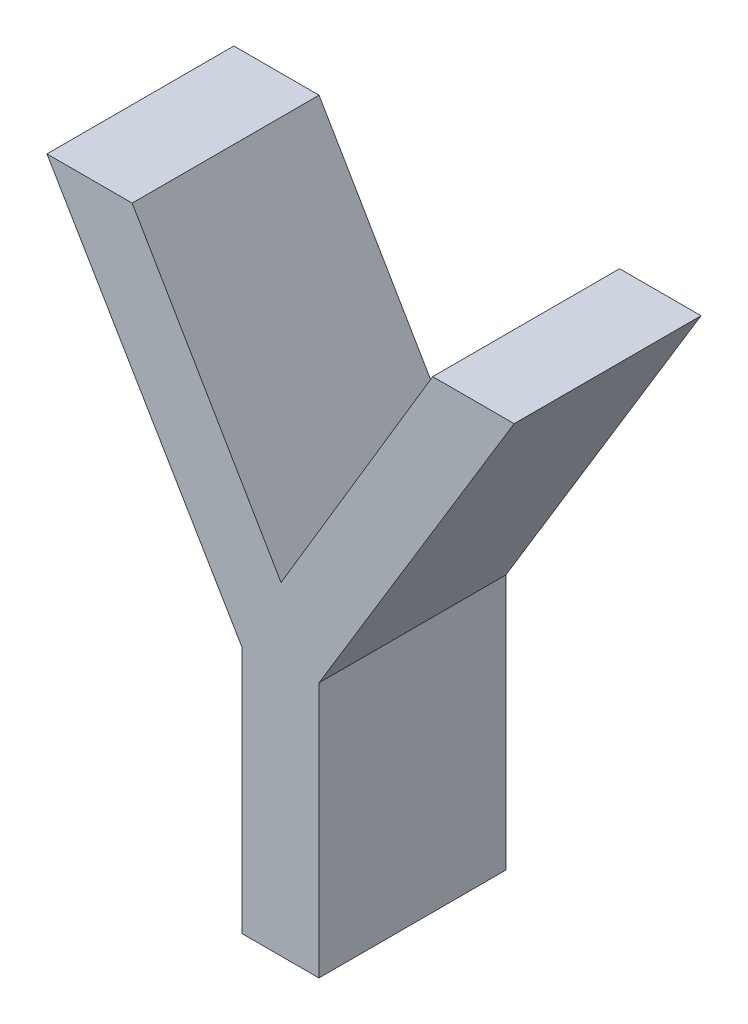
ISO-10303-21;
HEADER;
FILE_DESCRIPTION(('STEP AP214'),'2;1');
FILE_NAME('part.step','',(''),(''),'','','');
FILE_SCHEMA(('AUTOMOTIVE_DESIGN { 1 0 10303 214 1 1 1 1 }'));
ENDSEC;
DATA;
#1=APPLICATION_CONTEXT('core data for automotive mechanical design processes');
#2=APPLICATION_PROTOCOL_DEFINITION('international standard','automotive_design',2000,#1);
#3=PRODUCT_CONTEXT('',#1,'mechanical');
#4=PRODUCT('Part','Part','',(#3));
#5=PRODUCT_RELATED_PRODUCT_CATEGORY('part','',(#4));
#6=PRODUCT_DEFINITION_FORMATION('','',#4);
#7=PRODUCT_DEFINITION_CONTEXT('part definition',#1,'design');
#8=PRODUCT_DEFINITION('design','',#6,#7);
#9=PRODUCT_DEFINITION_SHAPE('','',#8);
#10=(LENGTH_UNIT() NAMED_UNIT(*) SI_UNIT(.MILLI.,.METRE.));
#11=(NAMED_UNIT(*) PLANE_ANGLE_UNIT() SI_UNIT($,.RADIAN.));
#12=(NAMED_UNIT(*) SI_UNIT($,.STERADIAN.) SOLID_ANGLE_UNIT());
#13=UNCERTAINTY_MEASURE_WITH_UNIT(LENGTH_MEASURE(1.E-05),#10,'distance_accuracy_value','');
#14=(GEOMETRIC_REPRESENTATION_CONTEXT(3) GLOBAL_UNCERTAINTY_ASSIGNED_CONTEXT((#13)) GLOBAL_UNIT_ASSIGNED_CONTEXT((#10,
#11,#12)) REPRESENTATION_CONTEXT('',''));
#15=CARTESIAN_POINT('',(0.,0.,0.));
#16=DIRECTION('',(0.,0.,1.));
#17=DIRECTION('',(1.,0.,0.));
#18=AXIS2_PLACEMENT_3D('',#15,#16,#17);
#19=CARTESIAN_POINT('',(0.0464557612857669,-2.941706644287,0.));
#20=DIRECTION('',(1.,0.,0.));
#21=DIRECTION('',(0.,1.,0.));
#22=AXIS2_PLACEMENT_3D('',#19,#20,#21);
#23=PLANE('',#22);
#24=DIRECTION('',(0.,-1.,0.));
#25=VECTOR('',#24,1.);
#26=CARTESIAN_POINT('',(0.0464557612857669,-2.804939731235,0.));
#27=LINE('',#26,#25);
#28=CARTESIAN_POINT('',(0.0464557612857669,-2.804939731235,0.));
#29=VERTEX_POINT('',#28);
#30=CARTESIAN_POINT('',(0.0464557612857669,-2.941706644287,0.));
#31=VERTEX_POINT('',#30);
#32=EDGE_CURVE('E11',#29,#31,#27,.T.);
#33=ORIENTED_EDGE('',*,*,#32,.F.);
#34=DIRECTION('',(0.,0.,1.));
#35=VECTOR('',#34,1.);
#36=CARTESIAN_POINT('',(0.0464557612857669,-2.804939731235,0.));
#37=LINE('',#36,#35);
#38=CARTESIAN_POINT('',(0.0464557612857669,-2.804939731235,0.1));
#39=VERTEX_POINT('',#38);
#40=EDGE_CURVE('E24',#29,#39,#37,.T.);
#41=ORIENTED_EDGE('',*,*,#40,.T.);
#42=DIRECTION('',(0.,1.,0.));
#43=VECTOR('',#42,1.);
#44=CARTESIAN_POINT('',(0.0464557612857669,-2.804939731235,0.1));
#45=LINE('',#44,#43);
#46=CARTESIAN_POINT('',(0.0464557612857669,-2.941706644287,0.1));
#47=VERTEX_POINT('',#46);
#48=EDGE_CURVE('E106',#47,#39,#45,.T.);
#49=ORIENTED_EDGE('',*,*,#48,.F.);
#50=DIRECTION('',(0.,0.,1.));
#51=VECTOR('',#50,1.);
#52=CARTESIAN_POINT('',(0.0464557612857669,-2.941706644287,0.));
#53=LINE('',#52,#51);
#54=EDGE_CURVE('E155',#31,#47,#53,.T.);
#55=ORIENTED_EDGE('',*,*,#54,.F.);
#56=EDGE_LOOP('',(#33,#41,#49,#55));
#57=FACE_BOUND('',#56,.T.);
#58=ADVANCED_FACE('F17',(#57),#23,.T.);
#59=CARTESIAN_POINT('',(0.00537558959963614,-2.941706644287,0.));
#60=DIRECTION('',(0.,-1.,0.));
#61=DIRECTION('',(1.,0.,0.));
#62=AXIS2_PLACEMENT_3D('',#59,#60,#61);
#63=PLANE('',#62);
#64=DIRECTION('',(-1.,0.,0.));
#65=VECTOR('',#64,1.);
#66=CARTESIAN_POINT('',(0.0464557612857669,-2.941706644287,0.));
#67=LINE('',#66,#65);
#68=CARTESIAN_POINT('',(0.00537558959963614,-2.941706644287,0.));
#69=VERTEX_POINT('',#68);
#70=EDGE_CURVE('E153',#31,#69,#67,.T.);
#71=ORIENTED_EDGE('',*,*,#70,.F.);
#72=ORIENTED_EDGE('',*,*,#54,.T.);
#73=DIRECTION('',(1.,0.,0.));
#74=VECTOR('',#73,1.);
#75=CARTESIAN_POINT('',(0.0464557612857669,-2.941706644287,0.1));
#76=LINE('',#75,#74);
#77=CARTESIAN_POINT('',(0.00537558959963614,-2.941706644287,0.1));
#78=VERTEX_POINT('',#77);
#79=EDGE_CURVE('E151',#78,#47,#76,.T.);
#80=ORIENTED_EDGE('',*,*,#79,.F.);
#81=DIRECTION('',(0.,0.,1.));
#82=VECTOR('',#81,1.);
#83=CARTESIAN_POINT('',(0.00537558959963614,-2.941706644287,0.));
#84=LINE('',#83,#82);
#85=EDGE_CURVE('E148',#69,#78,#84,.T.);
#86=ORIENTED_EDGE('',*,*,#85,.F.);
#87=EDGE_LOOP('',(#71,#72,#80,#86));
#88=FACE_BOUND('',#87,.T.);
#89=ADVANCED_FACE('F181',(#88),#63,.T.);
#90=CARTESIAN_POINT('',(0.00537558959963614,-2.809198041714,0.));
#91=DIRECTION('',(-1.,0.,0.));
#92=DIRECTION('',(0.,-1.,0.));
#93=AXIS2_PLACEMENT_3D('',#90,#91,#92);
#94=PLANE('',#93);
#95=DIRECTION('',(0.,1.,0.));
#96=VECTOR('',#95,1.);
#97=CARTESIAN_POINT('',(0.00537558959963614,-2.941706644287,0.));
#98=LINE('',#97,#96);
#99=CARTESIAN_POINT('',(0.00537558959963614,-2.809198041714,0.));
#100=VERTEX_POINT('',#99);
#101=EDGE_CURVE('E146',#69,#100,#98,.T.);
#102=ORIENTED_EDGE('',*,*,#101,.F.);
#103=ORIENTED_EDGE('',*,*,#85,.T.);
#104=DIRECTION('',(0.,-1.,0.));
#105=VECTOR('',#104,1.);
#106=CARTESIAN_POINT('',(0.00537558959963614,-2.941706644287,0.1));
#107=LINE('',#106,#105);
#108=CARTESIAN_POINT('',(0.00537558959963614,-2.809198041714,0.1));
#109=VERTEX_POINT('',#108);
#110=EDGE_CURVE('E143',#109,#78,#107,.T.);
#111=ORIENTED_EDGE('',*,*,#110,.F.);
#112=DIRECTION('',(0.,0.,1.));
#113=VECTOR('',#112,1.);
#114=CARTESIAN_POINT('',(0.00537558959963614,-2.809198041714,0.));
#115=LINE('',#114,#113);
#116=EDGE_CURVE('E140',#100,#109,#115,.T.);
#117=ORIENTED_EDGE('',*,*,#116,.F.);
#118=EDGE_LOOP('',(#102,#103,#111,#117));
#119=FACE_BOUND('',#118,.T.);
#120=ADVANCED_FACE('F177',(#119),#94,.T.);
#121=CARTESIAN_POINT('',(-0.0990782615779036,-2.632603401234,0.));
#122=DIRECTION('',(-0.860707703064184,-0.509099449897538,0.));
#123=DIRECTION('',(0.509099449897538,-0.860707703064184,0.));
#124=AXIS2_PLACEMENT_3D('',#121,#122,#123);
#125=PLANE('',#124);
#126=DIRECTION('',(-0.509099449897538,0.860707703064184,0.));
#127=VECTOR('',#126,1.);
#128=CARTESIAN_POINT('',(0.00537558959963614,-2.809198041714,0.));
#129=LINE('',#128,#127);
#130=CARTESIAN_POINT('',(-0.0990782615779036,-2.632603401234,0.));
#131=VERTEX_POINT('',#130);
#132=EDGE_CURVE('E138',#100,#131,#129,.T.);
#133=ORIENTED_EDGE('',*,*,#132,.F.);
#134=ORIENTED_EDGE('',*,*,#116,.T.);
#135=DIRECTION('',(0.509099449897538,-0.860707703064184,0.));
#136=VECTOR('',#135,1.);
#137=CARTESIAN_POINT('',(0.00537558959963614,-2.809198041714,0.1));
#138=LINE('',#137,#136);
#139=CARTESIAN_POINT('',(-0.0990782615779036,-2.632603401234,0.1));
#140=VERTEX_POINT('',#139);
#141=EDGE_CURVE('E135',#140,#109,#138,.T.);
#142=ORIENTED_EDGE('',*,*,#141,.F.);
#143=DIRECTION('',(0.,0.,1.));
#144=VECTOR('',#143,1.);
#145=CARTESIAN_POINT('',(-0.0990782615779036,-2.632603401234,0.));
#146=LINE('',#145,#144);
#147=EDGE_CURVE('E132',#131,#140,#146,.T.);
#148=ORIENTED_EDGE('',*,*,#147,.F.);
#149=EDGE_LOOP('',(#133,#134,#142,#148));
#150=FACE_BOUND('',#149,.T.);
#151=ADVANCED_FACE('F173',(#150),#125,.T.);
#152=CARTESIAN_POINT('',(-0.0534892905603683,-2.632603401234,0.));
#153=DIRECTION('',(0.,1.,0.));
#154=DIRECTION('',(-1.,0.,0.));
#155=AXIS2_PLACEMENT_3D('',#152,#153,#154);
#156=PLANE('',#155);
#157=DIRECTION('',(1.,0.,0.));
#158=VECTOR('',#157,1.);
#159=CARTESIAN_POINT('',(-0.0990782615779036,-2.632603401234,0.));
#160=LINE('',#159,#158);
#161=CARTESIAN_POINT('',(-0.0534892905603683,-2.632603401234,0.));
#162=VERTEX_POINT('',#161);
#163=EDGE_CURVE('E130',#131,#162,#160,.T.);
#164=ORIENTED_EDGE('',*,*,#163,.F.);
#165=ORIENTED_EDGE('',*,*,#147,.T.);
#166=DIRECTION('',(-1.,0.,0.));
#167=VECTOR('',#166,1.);
#168=CARTESIAN_POINT('',(-0.0990782615779036,-2.632603401234,0.1));
#169=LINE('',#168,#167);
#170=CARTESIAN_POINT('',(-0.0534892905603683,-2.632603401234,0.1));
#171=VERTEX_POINT('',#170);
#172=EDGE_CURVE('E127',#171,#140,#169,.T.);
#173=ORIENTED_EDGE('',*,*,#172,.F.);
#174=DIRECTION('',(0.,0.,1.));
#175=VECTOR('',#174,1.);
#176=CARTESIAN_POINT('',(-0.0534892905603683,-2.632603401234,0.));
#177=LINE('',#176,#175);
#178=EDGE_CURVE('E124',#162,#171,#177,.T.);
#179=ORIENTED_EDGE('',*,*,#178,.F.);
#180=EDGE_LOOP('',(#164,#165,#173,#179));
#181=FACE_BOUND('',#180,.T.);
#182=ADVANCED_FACE('F169',(#181),#156,.T.);
#183=CARTESIAN_POINT('',(0.0261661642944462,-2.768618847732,0.));
#184=DIRECTION('',(0.862913061259437,0.505352400516577,0.));
#185=DIRECTION('',(-0.505352400516577,0.862913061259437,0.));
#186=AXIS2_PLACEMENT_3D('',#183,#184,#185);
#187=PLANE('',#186);
#188=DIRECTION('',(0.505352400516577,-0.862913061259437,0.));
#189=VECTOR('',#188,1.);
#190=CARTESIAN_POINT('',(-0.0534892905603683,-2.632603401234,0.));
#191=LINE('',#190,#189);
#192=CARTESIAN_POINT('',(0.0261661642944462,-2.768618847732,0.));
#193=VERTEX_POINT('',#192);
#194=EDGE_CURVE('E122',#162,#193,#191,.T.);
#195=ORIENTED_EDGE('',*,*,#194,.F.);
#196=ORIENTED_EDGE('',*,*,#178,.T.);
#197=DIRECTION('',(-0.505352400516577,0.862913061259437,0.));
#198=VECTOR('',#197,1.);
#199=CARTESIAN_POINT('',(-0.0534892905603683,-2.632603401234,0.1));
#200=LINE('',#199,#198);
#201=CARTESIAN_POINT('',(0.0261661642944462,-2.768618847732,0.1));
#202=VERTEX_POINT('',#201);
#203=EDGE_CURVE('E119',#202,#171,#200,.T.);
#204=ORIENTED_EDGE('',*,*,#203,.F.);
#205=DIRECTION('',(0.,0.,1.));
#206=VECTOR('',#205,1.);
#207=CARTESIAN_POINT('',(0.0261661642944462,-2.768618847732,0.));
#208=LINE('',#207,#206);
#209=EDGE_CURVE('E116',#193,#202,#208,.T.);
#210=ORIENTED_EDGE('',*,*,#209,.F.);
#211=EDGE_LOOP('',(#195,#196,#204,#210));
#212=FACE_BOUND('',#211,.T.);
#213=ADVANCED_FACE('F165',(#212),#187,.T.);
#214=CARTESIAN_POINT('',(0.107324552259729,-2.632603401234,0.));
#215=DIRECTION('',(-0.858746256029892,0.512401080946014,0.));
#216=DIRECTION('',(-0.512401080946014,-0.858746256029892,0.));
#217=AXIS2_PLACEMENT_3D('',#214,#215,#216);
#218=PLANE('',#217);
#219=DIRECTION('',(0.512401080946014,0.858746256029892,0.));
#220=VECTOR('',#219,1.);
#221=CARTESIAN_POINT('',(0.0261661642944462,-2.768618847732,0.));
#222=LINE('',#221,#220);
#223=CARTESIAN_POINT('',(0.107324552259729,-2.632603401234,0.));
#224=VERTEX_POINT('',#223);
#225=EDGE_CURVE('E114',#193,#224,#222,.T.);
#226=ORIENTED_EDGE('',*,*,#225,.F.);
#227=ORIENTED_EDGE('',*,*,#209,.T.);
#228=DIRECTION('',(-0.512401080946014,-0.858746256029892,0.));
#229=VECTOR('',#228,1.);
#230=CARTESIAN_POINT('',(0.0261661642944462,-2.768618847732,0.1));
#231=LINE('',#230,#229);
#232=CARTESIAN_POINT('',(0.107324552259729,-2.632603401234,0.1));
#233=VERTEX_POINT('',#232);
#234=EDGE_CURVE('E112',#233,#202,#231,.T.);
#235=ORIENTED_EDGE('',*,*,#234,.F.);
#236=DIRECTION('',(0.,0.,1.));
#237=VECTOR('',#236,1.);
#238=CARTESIAN_POINT('',(0.107324552259729,-2.632603401234,0.));
#239=LINE('',#238,#237);
#240=EDGE_CURVE('E91',#224,#233,#239,.T.);
#241=ORIENTED_EDGE('',*,*,#240,.F.);
#242=EDGE_LOOP('',(#226,#227,#235,#241));
#243=FACE_BOUND('',#242,.T.);
#244=ADVANCED_FACE('F163',(#243),#218,.T.);
#245=CARTESIAN_POINT('',(0.150909612463307,-2.632603401234,0.));
#246=DIRECTION('',(0.,1.,0.));
#247=DIRECTION('',(-1.,0.,0.));
#248=AXIS2_PLACEMENT_3D('',#245,#246,#247);
#249=PLANE('',#248);
#250=DIRECTION('',(1.,0.,0.));
#251=VECTOR('',#250,1.);
#252=CARTESIAN_POINT('',(0.107324552259729,-2.632603401234,0.));
#253=LINE('',#252,#251);
#254=CARTESIAN_POINT('',(0.150909612463307,-2.632603401234,0.));
#255=VERTEX_POINT('',#254);
#256=EDGE_CURVE('E95',#224,#255,#253,.T.);
#257=ORIENTED_EDGE('',*,*,#256,.F.);
#258=ORIENTED_EDGE('',*,*,#240,.T.);
#259=DIRECTION('',(-1.,0.,0.));
#260=VECTOR('',#259,1.);
#261=CARTESIAN_POINT('',(0.107324552259729,-2.632603401234,0.1));
#262=LINE('',#261,#260);
#263=CARTESIAN_POINT('',(0.150909612463307,-2.632603401234,0.1));
#264=VERTEX_POINT('',#263);
#265=EDGE_CURVE('E84',#264,#233,#262,.T.);
#266=ORIENTED_EDGE('',*,*,#265,.F.);
#267=DIRECTION('',(0.,0.,1.));
#268=VECTOR('',#267,1.);
#269=CARTESIAN_POINT('',(0.150909612463307,-2.632603401234,0.));
#270=LINE('',#269,#268);
#271=EDGE_CURVE('E88',#255,#264,#270,.T.);
#272=ORIENTED_EDGE('',*,*,#271,.F.);
#273=EDGE_LOOP('',(#257,#258,#266,#272));
#274=FACE_BOUND('',#273,.T.);
#275=ADVANCED_FACE('F87',(#274),#249,.T.);
#276=CARTESIAN_POINT('',(0.0464557612857669,-2.804939731235,0.));
#277=DIRECTION('',(0.855181135397279,-0.518329263750968,0.));
#278=DIRECTION('',(0.518329263750968,0.855181135397279,0.));
#279=AXIS2_PLACEMENT_3D('',#276,#277,#278);
#280=PLANE('',#279);
#281=DIRECTION('',(-0.518329263750968,-0.855181135397279,0.));
#282=VECTOR('',#281,1.);
#283=CARTESIAN_POINT('',(0.150909612463307,-2.632603401234,0.));
#284=LINE('',#283,#282);
#285=EDGE_CURVE('E101',#255,#29,#284,.T.);
#286=ORIENTED_EDGE('',*,*,#285,.F.);
#287=ORIENTED_EDGE('',*,*,#271,.T.);
#288=DIRECTION('',(0.518329263750968,0.855181135397279,0.));
#289=VECTOR('',#288,1.);
#290=CARTESIAN_POINT('',(0.150909612463307,-2.632603401234,0.1));
#291=LINE('',#290,#289);
#292=EDGE_CURVE('E100',#39,#264,#291,.T.);
#293=ORIENTED_EDGE('',*,*,#292,.F.);
#294=ORIENTED_EDGE('',*,*,#40,.F.);
#295=EDGE_LOOP('',(#286,#287,#293,#294));
#296=FACE_BOUND('',#295,.T.);
#297=ADVANCED_FACE('F99',(#296),#280,.T.);
#298=CARTESIAN_POINT('',(0.0258168777129998,-2.752696058328,0.));
#299=DIRECTION('',(0.,0.,1.));
#300=DIRECTION('',(1.,0.,0.));
#301=AXIS2_PLACEMENT_3D('',#298,#299,#300);
#302=PLANE('',#301);
#303=ORIENTED_EDGE('',*,*,#285,.T.);
#304=ORIENTED_EDGE('',*,*,#32,.T.);
#305=ORIENTED_EDGE('',*,*,#70,.T.);
#306=ORIENTED_EDGE('',*,*,#101,.T.);
#307=ORIENTED_EDGE('',*,*,#132,.T.);
#308=ORIENTED_EDGE('',*,*,#163,.T.);
#309=ORIENTED_EDGE('',*,*,#194,.T.);
#310=ORIENTED_EDGE('',*,*,#225,.T.);
#311=ORIENTED_EDGE('',*,*,#256,.T.);
#312=EDGE_LOOP('',(#303,#304,#305,#306,#307,#308,#309,#310,#311));
#313=FACE_BOUND('',#312,.T.);
#314=ADVANCED_FACE('F158',(#313),#302,.F.);
#315=CARTESIAN_POINT('',(0.0258168777129998,-2.752696058328,0.1));
#316=DIRECTION('',(0.,0.,1.));
#317=DIRECTION('',(1.,0.,0.));
#318=AXIS2_PLACEMENT_3D('',#315,#316,#317);
#319=PLANE('',#318);
#320=ORIENTED_EDGE('',*,*,#292,.T.);
#321=ORIENTED_EDGE('',*,*,#265,.T.);
#322=ORIENTED_EDGE('',*,*,#234,.T.);
#323=ORIENTED_EDGE('',*,*,#203,.T.);
#324=ORIENTED_EDGE('',*,*,#172,.T.);
#325=ORIENTED_EDGE('',*,*,#141,.T.);
#326=ORIENTED_EDGE('',*,*,#110,.T.);
#327=ORIENTED_EDGE('',*,*,#79,.T.);
#328=ORIENTED_EDGE('',*,*,#48,.T.);
#329=EDGE_LOOP('',(#320,#321,#322,#323,#324,#325,#326,#327,#328));
#330=FACE_BOUND('',#329,.T.);
#331=ADVANCED_FACE('F104',(#330),#319,.T.);
#332=CLOSED_SHELL('',(#58,#89,#120,#151,#182,#213,#244,#275,#297,#314,#331));
#333=MANIFOLD_SOLID_BREP('B1',#332);
#334=ADVANCED_BREP_SHAPE_REPRESENTATION('',(#18,#333),#14);
#335=SHAPE_DEFINITION_REPRESENTATION(#9,#334);
ENDSEC;
END-ISO-10303-21;
